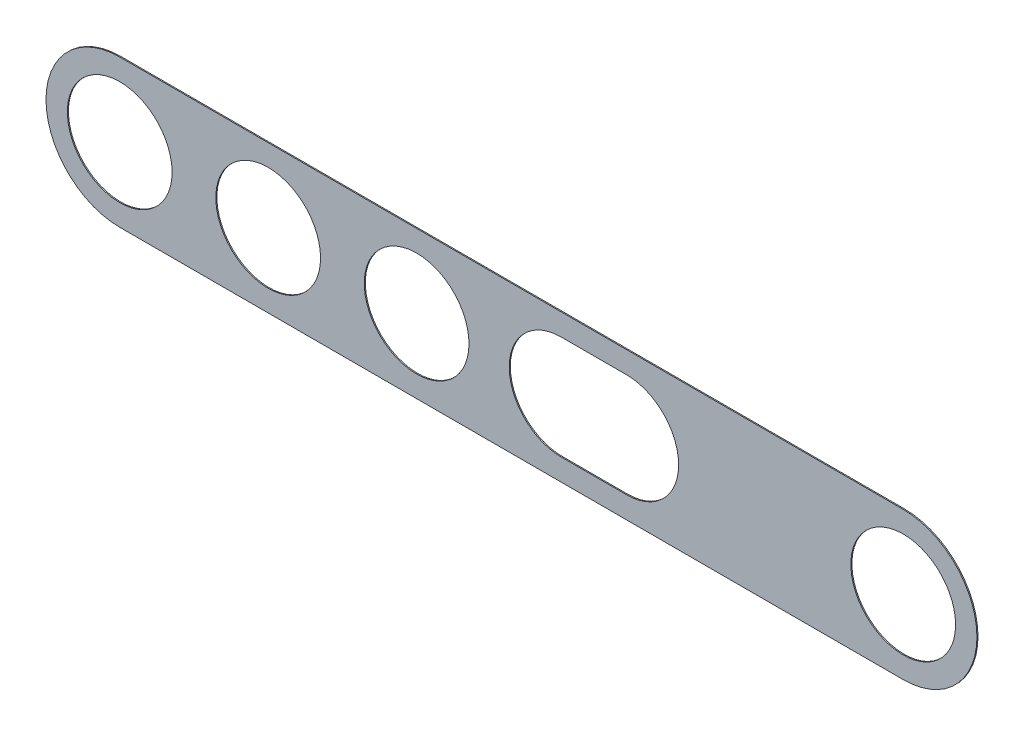
ISO-10303-21;
HEADER;
FILE_DESCRIPTION(('STEP AP214'),'2;1');
FILE_NAME('part.step','',(''),(''),'','','');
FILE_SCHEMA(('AUTOMOTIVE_DESIGN { 1 0 10303 214 1 1 1 1 }'));
ENDSEC;
DATA;
#1=APPLICATION_CONTEXT('core data for automotive mechanical design processes');
#2=APPLICATION_PROTOCOL_DEFINITION('international standard','automotive_design',2000,#1);
#3=PRODUCT_CONTEXT('',#1,'mechanical');
#4=PRODUCT('Part','Part','',(#3));
#5=PRODUCT_RELATED_PRODUCT_CATEGORY('part','',(#4));
#6=PRODUCT_DEFINITION_FORMATION('','',#4);
#7=PRODUCT_DEFINITION_CONTEXT('part definition',#1,'design');
#8=PRODUCT_DEFINITION('design','',#6,#7);
#9=PRODUCT_DEFINITION_SHAPE('','',#8);
#10=(LENGTH_UNIT() NAMED_UNIT(*) SI_UNIT(.MILLI.,.METRE.));
#11=(NAMED_UNIT(*) PLANE_ANGLE_UNIT() SI_UNIT($,.RADIAN.));
#12=(NAMED_UNIT(*) SI_UNIT($,.STERADIAN.) SOLID_ANGLE_UNIT());
#13=UNCERTAINTY_MEASURE_WITH_UNIT(LENGTH_MEASURE(1.E-05),#10,'distance_accuracy_value','');
#14=(GEOMETRIC_REPRESENTATION_CONTEXT(3) GLOBAL_UNCERTAINTY_ASSIGNED_CONTEXT((#13)) GLOBAL_UNIT_ASSIGNED_CONTEXT((#10,
#11,#12)) REPRESENTATION_CONTEXT('',''));
#15=CARTESIAN_POINT('',(0.,0.,0.));
#16=DIRECTION('',(0.,0.,1.));
#17=DIRECTION('',(1.,0.,0.));
#18=AXIS2_PLACEMENT_3D('',#15,#16,#17);
#19=CARTESIAN_POINT('',(0.,0.,-0.805));
#20=DIRECTION('',(0.,0.,1.));
#21=DIRECTION('',(1.,0.,0.));
#22=AXIS2_PLACEMENT_3D('',#19,#20,#21);
#23=PLANE('',#22);
#24=CARTESIAN_POINT('',(13.96785551477,0.,-0.805));
#25=DIRECTION('',(0.,0.,1.));
#26=DIRECTION('',(1.,0.,0.));
#27=AXIS2_PLACEMENT_3D('',#24,#25,#26);
#28=CIRCLE('',#27,6.3);
#29=CARTESIAN_POINT('',(13.96785551477,-6.3,-0.805));
#30=VERTEX_POINT('',#29);
#31=CARTESIAN_POINT('',(13.96785551477,6.3,-0.805));
#32=VERTEX_POINT('',#31);
#33=EDGE_CURVE('E111',#30,#32,#28,.T.);
#34=ORIENTED_EDGE('',*,*,#33,.T.);
#35=DIRECTION('',(1.,0.,0.));
#36=VECTOR('',#35,1.);
#37=CARTESIAN_POINT('',(6.032144485231,6.3,-0.805));
#38=LINE('',#37,#36);
#39=CARTESIAN_POINT('',(6.032144485231,6.3,-0.805));
#40=VERTEX_POINT('',#39);
#41=EDGE_CURVE('E109',#40,#32,#38,.T.);
#42=ORIENTED_EDGE('',*,*,#41,.F.);
#43=CARTESIAN_POINT('',(6.032144485231,0.,-0.805));
#44=DIRECTION('',(0.,0.,1.));
#45=DIRECTION('',(1.,0.,0.));
#46=AXIS2_PLACEMENT_3D('',#43,#44,#45);
#47=CIRCLE('',#46,6.3);
#48=CARTESIAN_POINT('',(6.032144485231,-6.3,-0.805));
#49=VERTEX_POINT('',#48);
#50=EDGE_CURVE('E139',#40,#49,#47,.T.);
#51=ORIENTED_EDGE('',*,*,#50,.T.);
#52=DIRECTION('',(1.,0.,0.));
#53=VECTOR('',#52,1.);
#54=CARTESIAN_POINT('',(13.96785551477,-6.3,-0.805));
#55=LINE('',#54,#53);
#56=EDGE_CURVE('E104',#30,#49,#55,.F.);
#57=ORIENTED_EDGE('',*,*,#56,.F.);
#58=EDGE_LOOP('',(#34,#42,#51,#57));
#59=FACE_BOUND('',#58,.T.);
#60=CARTESIAN_POINT('',(47.5,0.,-0.805));
#61=DIRECTION('',(0.,0.,1.));
#62=DIRECTION('',(1.,0.,0.));
#63=AXIS2_PLACEMENT_3D('',#60,#61,#62);
#64=CIRCLE('',#63,6.35);
#65=CARTESIAN_POINT('',(53.85,0.,-0.805));
#66=VERTEX_POINT('',#65);
#67=EDGE_CURVE('E141',#66,#66,#64,.T.);
#68=ORIENTED_EDGE('',*,*,#67,.T.);
#69=EDGE_LOOP('',(#68));
#70=FACE_BOUND('',#69,.T.);
#71=CARTESIAN_POINT('',(-47.5,0.,-0.805));
#72=DIRECTION('',(0.,0.,1.));
#73=DIRECTION('',(1.,0.,0.));
#74=AXIS2_PLACEMENT_3D('',#71,#72,#73);
#75=CIRCLE('',#74,6.35);
#76=CARTESIAN_POINT('',(-41.15,0.,-0.805));
#77=VERTEX_POINT('',#76);
#78=EDGE_CURVE('E144',#77,#77,#75,.T.);
#79=ORIENTED_EDGE('',*,*,#78,.T.);
#80=EDGE_LOOP('',(#79));
#81=FACE_BOUND('',#80,.T.);
#82=CARTESIAN_POINT('',(-29.5,0.,-0.805));
#83=DIRECTION('',(0.,0.,1.));
#84=DIRECTION('',(1.,0.,0.));
#85=AXIS2_PLACEMENT_3D('',#82,#83,#84);
#86=CIRCLE('',#85,6.35);
#87=CARTESIAN_POINT('',(-23.15,0.,-0.805));
#88=VERTEX_POINT('',#87);
#89=EDGE_CURVE('E147',#88,#88,#86,.T.);
#90=ORIENTED_EDGE('',*,*,#89,.T.);
#91=EDGE_LOOP('',(#90));
#92=FACE_BOUND('',#91,.T.);
#93=CARTESIAN_POINT('',(-11.5,0.,-0.805));
#94=DIRECTION('',(0.,0.,1.));
#95=DIRECTION('',(1.,0.,0.));
#96=AXIS2_PLACEMENT_3D('',#93,#94,#95);
#97=CIRCLE('',#96,6.35);
#98=CARTESIAN_POINT('',(-5.15,0.,-0.805));
#99=VERTEX_POINT('',#98);
#100=EDGE_CURVE('E150',#99,#99,#97,.T.);
#101=ORIENTED_EDGE('',*,*,#100,.T.);
#102=EDGE_LOOP('',(#101));
#103=FACE_BOUND('',#102,.T.);
#104=CARTESIAN_POINT('',(47.5,0.,-0.805));
#105=DIRECTION('',(0.,0.,1.));
#106=DIRECTION('',(1.,0.,0.));
#107=AXIS2_PLACEMENT_3D('',#104,#105,#106);
#108=CIRCLE('',#107,8.94);
#109=CARTESIAN_POINT('',(47.5,-8.94,-0.805));
#110=VERTEX_POINT('',#109);
#111=CARTESIAN_POINT('',(47.5,8.94,-0.805));
#112=VERTEX_POINT('',#111);
#113=EDGE_CURVE('E20',#110,#112,#108,.T.);
#114=ORIENTED_EDGE('',*,*,#113,.F.);
#115=DIRECTION('',(1.,0.,0.));
#116=VECTOR('',#115,1.);
#117=CARTESIAN_POINT('',(-47.5,-8.94,-0.805));
#118=LINE('',#117,#116);
#119=CARTESIAN_POINT('',(-47.5,-8.94,-0.805));
#120=VERTEX_POINT('',#119);
#121=EDGE_CURVE('E82',#120,#110,#118,.T.);
#122=ORIENTED_EDGE('',*,*,#121,.F.);
#123=CARTESIAN_POINT('',(-47.5,0.,-0.805));
#124=DIRECTION('',(0.,0.,1.));
#125=DIRECTION('',(1.,0.,0.));
#126=AXIS2_PLACEMENT_3D('',#123,#124,#125);
#127=CIRCLE('',#126,8.94);
#128=CARTESIAN_POINT('',(-47.5,8.94,-0.805));
#129=VERTEX_POINT('',#128);
#130=EDGE_CURVE('E152',#129,#120,#127,.T.);
#131=ORIENTED_EDGE('',*,*,#130,.F.);
#132=DIRECTION('',(1.,0.,0.));
#133=VECTOR('',#132,1.);
#134=CARTESIAN_POINT('',(47.5,8.94,-0.805));
#135=LINE('',#134,#133);
#136=EDGE_CURVE('E85',#112,#129,#135,.F.);
#137=ORIENTED_EDGE('',*,*,#136,.F.);
#138=EDGE_LOOP('',(#114,#122,#131,#137));
#139=FACE_BOUND('',#138,.T.);
#140=ADVANCED_FACE('F17',(#59,#70,#81,#92,#103,#139),#23,.F.);
#141=CARTESIAN_POINT('',(-47.5,-8.94,-0.675));
#142=DIRECTION('',(0.,-1.,0.));
#143=DIRECTION('',(0.,0.,-1.));
#144=AXIS2_PLACEMENT_3D('',#141,#142,#143);
#145=PLANE('',#144);
#146=DIRECTION('',(0.,0.,1.));
#147=VECTOR('',#146,1.);
#148=CARTESIAN_POINT('',(47.5,-8.94,-0.675));
#149=LINE('',#148,#147);
#150=CARTESIAN_POINT('',(47.5,-8.94,-0.675));
#151=VERTEX_POINT('',#150);
#152=EDGE_CURVE('E88',#151,#110,#149,.F.);
#153=ORIENTED_EDGE('',*,*,#152,.F.);
#154=DIRECTION('',(1.,0.,0.));
#155=VECTOR('',#154,1.);
#156=CARTESIAN_POINT('',(0.,-8.94,-0.675));
#157=LINE('',#156,#155);
#158=CARTESIAN_POINT('',(-47.5,-8.94,-0.675));
#159=VERTEX_POINT('',#158);
#160=EDGE_CURVE('E136',#159,#151,#157,.T.);
#161=ORIENTED_EDGE('',*,*,#160,.F.);
#162=DIRECTION('',(0.,0.,1.));
#163=VECTOR('',#162,1.);
#164=CARTESIAN_POINT('',(-47.5,-8.94,-0.675));
#165=LINE('',#164,#163);
#166=EDGE_CURVE('E94',#120,#159,#165,.T.);
#167=ORIENTED_EDGE('',*,*,#166,.F.);
#168=ORIENTED_EDGE('',*,*,#121,.T.);
#169=EDGE_LOOP('',(#153,#161,#167,#168));
#170=FACE_BOUND('',#169,.T.);
#171=ADVANCED_FACE('F90',(#170),#145,.T.);
#172=CARTESIAN_POINT('',(47.5,0.,-0.675));
#173=DIRECTION('',(0.,0.,1.));
#174=DIRECTION('',(1.,0.,0.));
#175=AXIS2_PLACEMENT_3D('',#172,#173,#174);
#176=CYLINDRICAL_SURFACE('',#175,8.94);
#177=DIRECTION('',(0.,0.,1.));
#178=VECTOR('',#177,1.);
#179=CARTESIAN_POINT('',(47.5,8.94,-0.675));
#180=LINE('',#179,#178);
#181=CARTESIAN_POINT('',(47.5,8.94,-0.675));
#182=VERTEX_POINT('',#181);
#183=EDGE_CURVE('E87',#182,#112,#180,.F.);
#184=ORIENTED_EDGE('',*,*,#183,.F.);
#185=CARTESIAN_POINT('',(47.5,0.,-0.675));
#186=DIRECTION('',(0.,0.,1.));
#187=DIRECTION('',(1.,0.,0.));
#188=AXIS2_PLACEMENT_3D('',#185,#186,#187);
#189=CIRCLE('',#188,8.94);
#190=EDGE_CURVE('E98',#151,#182,#189,.T.);
#191=ORIENTED_EDGE('',*,*,#190,.F.);
#192=ORIENTED_EDGE('',*,*,#152,.T.);
#193=ORIENTED_EDGE('',*,*,#113,.T.);
#194=EDGE_LOOP('',(#184,#191,#192,#193));
#195=FACE_BOUND('',#194,.T.);
#196=ADVANCED_FACE('F97',(#195),#176,.T.);
#197=CARTESIAN_POINT('',(47.5,8.94,-0.675));
#198=DIRECTION('',(0.,1.,0.));
#199=DIRECTION('',(0.,0.,1.));
#200=AXIS2_PLACEMENT_3D('',#197,#198,#199);
#201=PLANE('',#200);
#202=DIRECTION('',(0.,0.,1.));
#203=VECTOR('',#202,1.);
#204=CARTESIAN_POINT('',(-47.5,8.94,-0.675));
#205=LINE('',#204,#203);
#206=CARTESIAN_POINT('',(-47.5,8.94,-0.675));
#207=VERTEX_POINT('',#206);
#208=EDGE_CURVE('E115',#207,#129,#205,.F.);
#209=ORIENTED_EDGE('',*,*,#208,.F.);
#210=DIRECTION('',(1.,0.,0.));
#211=VECTOR('',#210,1.);
#212=CARTESIAN_POINT('',(0.,8.94,-0.675));
#213=LINE('',#212,#211);
#214=EDGE_CURVE('E134',#182,#207,#213,.F.);
#215=ORIENTED_EDGE('',*,*,#214,.F.);
#216=ORIENTED_EDGE('',*,*,#183,.T.);
#217=ORIENTED_EDGE('',*,*,#136,.T.);
#218=EDGE_LOOP('',(#209,#215,#216,#217));
#219=FACE_BOUND('',#218,.T.);
#220=ADVANCED_FACE('F209',(#219),#201,.T.);
#221=CARTESIAN_POINT('',(-47.5,0.,-0.675));
#222=DIRECTION('',(0.,0.,1.));
#223=DIRECTION('',(1.,0.,0.));
#224=AXIS2_PLACEMENT_3D('',#221,#222,#223);
#225=CYLINDRICAL_SURFACE('',#224,8.94);
#226=ORIENTED_EDGE('',*,*,#166,.T.);
#227=CARTESIAN_POINT('',(-47.5,0.,-0.675));
#228=DIRECTION('',(0.,0.,1.));
#229=DIRECTION('',(1.,0.,0.));
#230=AXIS2_PLACEMENT_3D('',#227,#228,#229);
#231=CIRCLE('',#230,8.94);
#232=EDGE_CURVE('E132',#207,#159,#231,.T.);
#233=ORIENTED_EDGE('',*,*,#232,.F.);
#234=ORIENTED_EDGE('',*,*,#208,.T.);
#235=ORIENTED_EDGE('',*,*,#130,.T.);
#236=EDGE_LOOP('',(#226,#233,#234,#235));
#237=FACE_BOUND('',#236,.T.);
#238=ADVANCED_FACE('F200',(#237),#225,.T.);
#239=CARTESIAN_POINT('',(-11.5,0.,-0.675));
#240=DIRECTION('',(0.,0.,1.));
#241=DIRECTION('',(1.,0.,0.));
#242=AXIS2_PLACEMENT_3D('',#239,#240,#241);
#243=CYLINDRICAL_SURFACE('',#242,6.35);
#244=ORIENTED_EDGE('',*,*,#100,.F.);
#245=EDGE_LOOP('',(#244));
#246=FACE_BOUND('',#245,.T.);
#247=CARTESIAN_POINT('',(-11.5,0.,-0.675));
#248=DIRECTION('',(0.,0.,1.));
#249=DIRECTION('',(1.,0.,0.));
#250=AXIS2_PLACEMENT_3D('',#247,#248,#249);
#251=CIRCLE('',#250,6.35);
#252=CARTESIAN_POINT('',(-5.15,0.,-0.675));
#253=VERTEX_POINT('',#252);
#254=EDGE_CURVE('E129',#253,#253,#251,.F.);
#255=ORIENTED_EDGE('',*,*,#254,.F.);
#256=EDGE_LOOP('',(#255));
#257=FACE_BOUND('',#256,.T.);
#258=ADVANCED_FACE('F196',(#246,#257),#243,.F.);
#259=CARTESIAN_POINT('',(-29.5,0.,-0.675));
#260=DIRECTION('',(0.,0.,1.));
#261=DIRECTION('',(1.,0.,0.));
#262=AXIS2_PLACEMENT_3D('',#259,#260,#261);
#263=CYLINDRICAL_SURFACE('',#262,6.35);
#264=ORIENTED_EDGE('',*,*,#89,.F.);
#265=EDGE_LOOP('',(#264));
#266=FACE_BOUND('',#265,.T.);
#267=CARTESIAN_POINT('',(-29.5,0.,-0.675));
#268=DIRECTION('',(0.,0.,1.));
#269=DIRECTION('',(1.,0.,0.));
#270=AXIS2_PLACEMENT_3D('',#267,#268,#269);
#271=CIRCLE('',#270,6.35);
#272=CARTESIAN_POINT('',(-23.15,0.,-0.675));
#273=VERTEX_POINT('',#272);
#274=EDGE_CURVE('E126',#273,#273,#271,.F.);
#275=ORIENTED_EDGE('',*,*,#274,.F.);
#276=EDGE_LOOP('',(#275));
#277=FACE_BOUND('',#276,.T.);
#278=ADVANCED_FACE('F199',(#266,#277),#263,.F.);
#279=CARTESIAN_POINT('',(-47.5,0.,-0.675));
#280=DIRECTION('',(0.,0.,1.));
#281=DIRECTION('',(1.,0.,0.));
#282=AXIS2_PLACEMENT_3D('',#279,#280,#281);
#283=CYLINDRICAL_SURFACE('',#282,6.35);
#284=ORIENTED_EDGE('',*,*,#78,.F.);
#285=EDGE_LOOP('',(#284));
#286=FACE_BOUND('',#285,.T.);
#287=CARTESIAN_POINT('',(-47.5,0.,-0.675));
#288=DIRECTION('',(0.,0.,1.));
#289=DIRECTION('',(1.,0.,0.));
#290=AXIS2_PLACEMENT_3D('',#287,#288,#289);
#291=CIRCLE('',#290,6.35);
#292=CARTESIAN_POINT('',(-41.15,0.,-0.675));
#293=VERTEX_POINT('',#292);
#294=EDGE_CURVE('E123',#293,#293,#291,.F.);
#295=ORIENTED_EDGE('',*,*,#294,.F.);
#296=EDGE_LOOP('',(#295));
#297=FACE_BOUND('',#296,.T.);
#298=ADVANCED_FACE('F257',(#286,#297),#283,.F.);
#299=CARTESIAN_POINT('',(47.5,0.,-0.675));
#300=DIRECTION('',(0.,0.,1.));
#301=DIRECTION('',(1.,0.,0.));
#302=AXIS2_PLACEMENT_3D('',#299,#300,#301);
#303=CYLINDRICAL_SURFACE('',#302,6.35);
#304=ORIENTED_EDGE('',*,*,#67,.F.);
#305=EDGE_LOOP('',(#304));
#306=FACE_BOUND('',#305,.T.);
#307=CARTESIAN_POINT('',(47.5,0.,-0.675));
#308=DIRECTION('',(0.,0.,1.));
#309=DIRECTION('',(1.,0.,0.));
#310=AXIS2_PLACEMENT_3D('',#307,#308,#309);
#311=CIRCLE('',#310,6.35);
#312=CARTESIAN_POINT('',(53.85,0.,-0.675));
#313=VERTEX_POINT('',#312);
#314=EDGE_CURVE('E120',#313,#313,#311,.F.);
#315=ORIENTED_EDGE('',*,*,#314,.F.);
#316=EDGE_LOOP('',(#315));
#317=FACE_BOUND('',#316,.T.);
#318=ADVANCED_FACE('F266',(#306,#317),#303,.F.);
#319=CARTESIAN_POINT('',(6.032144485231,0.,-0.675));
#320=DIRECTION('',(0.,0.,1.));
#321=DIRECTION('',(1.,0.,0.));
#322=AXIS2_PLACEMENT_3D('',#319,#320,#321);
#323=CYLINDRICAL_SURFACE('',#322,6.3);
#324=ORIENTED_EDGE('',*,*,#50,.F.);
#325=DIRECTION('',(0.,0.,-1.));
#326=VECTOR('',#325,1.);
#327=CARTESIAN_POINT('',(6.032144485231,6.3,-0.675));
#328=LINE('',#327,#326);
#329=CARTESIAN_POINT('',(6.032144485231,6.3,-0.675));
#330=VERTEX_POINT('',#329);
#331=EDGE_CURVE('E112',#330,#40,#328,.T.);
#332=ORIENTED_EDGE('',*,*,#331,.F.);
#333=CARTESIAN_POINT('',(6.032144485231,0.,-0.675));
#334=DIRECTION('',(0.,0.,1.));
#335=DIRECTION('',(1.,0.,0.));
#336=AXIS2_PLACEMENT_3D('',#333,#334,#335);
#337=CIRCLE('',#336,6.3);
#338=CARTESIAN_POINT('',(6.032144485231,-6.3,-0.675));
#339=VERTEX_POINT('',#338);
#340=EDGE_CURVE('E118',#339,#330,#337,.F.);
#341=ORIENTED_EDGE('',*,*,#340,.F.);
#342=DIRECTION('',(0.,0.,1.));
#343=VECTOR('',#342,1.);
#344=CARTESIAN_POINT('',(6.032144485231,-6.3,-0.675));
#345=LINE('',#344,#343);
#346=EDGE_CURVE('E107',#49,#339,#345,.T.);
#347=ORIENTED_EDGE('',*,*,#346,.F.);
#348=EDGE_LOOP('',(#324,#332,#341,#347));
#349=FACE_BOUND('',#348,.T.);
#350=ADVANCED_FACE('F184',(#349),#323,.F.);
#351=CARTESIAN_POINT('',(6.032144485231,6.3,-0.675));
#352=DIRECTION('',(0.,-1.,0.));
#353=DIRECTION('',(0.,0.,-1.));
#354=AXIS2_PLACEMENT_3D('',#351,#352,#353);
#355=PLANE('',#354);
#356=DIRECTION('',(0.,0.,1.));
#357=VECTOR('',#356,1.);
#358=CARTESIAN_POINT('',(13.96785551477,6.3,-0.675));
#359=LINE('',#358,#357);
#360=CARTESIAN_POINT('',(13.96785551477,6.3,-0.675));
#361=VERTEX_POINT('',#360);
#362=EDGE_CURVE('E138',#32,#361,#359,.T.);
#363=ORIENTED_EDGE('',*,*,#362,.T.);
#364=DIRECTION('',(1.,0.,0.));
#365=VECTOR('',#364,1.);
#366=CARTESIAN_POINT('',(0.,6.3,-0.675));
#367=LINE('',#366,#365);
#368=EDGE_CURVE('E117',#330,#361,#367,.T.);
#369=ORIENTED_EDGE('',*,*,#368,.F.);
#370=ORIENTED_EDGE('',*,*,#331,.T.);
#371=ORIENTED_EDGE('',*,*,#41,.T.);
#372=EDGE_LOOP('',(#363,#369,#370,#371));
#373=FACE_BOUND('',#372,.T.);
#374=ADVANCED_FACE('F173',(#373),#355,.T.);
#375=CARTESIAN_POINT('',(13.96785551477,0.,-0.675));
#376=DIRECTION('',(0.,0.,1.));
#377=DIRECTION('',(1.,0.,0.));
#378=AXIS2_PLACEMENT_3D('',#375,#376,#377);
#379=CYLINDRICAL_SURFACE('',#378,6.3);
#380=ORIENTED_EDGE('',*,*,#33,.F.);
#381=DIRECTION('',(0.,0.,1.));
#382=VECTOR('',#381,1.);
#383=CARTESIAN_POINT('',(13.96785551477,-6.3,-0.675));
#384=LINE('',#383,#382);
#385=CARTESIAN_POINT('',(13.96785551477,-6.3,-0.675));
#386=VERTEX_POINT('',#385);
#387=EDGE_CURVE('E108',#386,#30,#384,.F.);
#388=ORIENTED_EDGE('',*,*,#387,.F.);
#389=CARTESIAN_POINT('',(13.96785551477,0.,-0.675));
#390=DIRECTION('',(0.,0.,1.));
#391=DIRECTION('',(1.,0.,0.));
#392=AXIS2_PLACEMENT_3D('',#389,#390,#391);
#393=CIRCLE('',#392,6.3);
#394=EDGE_CURVE('E26',#361,#386,#393,.F.);
#395=ORIENTED_EDGE('',*,*,#394,.F.);
#396=ORIENTED_EDGE('',*,*,#362,.F.);
#397=EDGE_LOOP('',(#380,#388,#395,#396));
#398=FACE_BOUND('',#397,.T.);
#399=ADVANCED_FACE('F177',(#398),#379,.F.);
#400=CARTESIAN_POINT('',(13.96785551477,-6.3,-0.675));
#401=DIRECTION('',(0.,1.,0.));
#402=DIRECTION('',(0.,0.,1.));
#403=AXIS2_PLACEMENT_3D('',#400,#401,#402);
#404=PLANE('',#403);
#405=ORIENTED_EDGE('',*,*,#346,.T.);
#406=DIRECTION('',(1.,0.,0.));
#407=VECTOR('',#406,1.);
#408=CARTESIAN_POINT('',(0.,-6.3,-0.675));
#409=LINE('',#408,#407);
#410=EDGE_CURVE('E11',#386,#339,#409,.F.);
#411=ORIENTED_EDGE('',*,*,#410,.F.);
#412=ORIENTED_EDGE('',*,*,#387,.T.);
#413=ORIENTED_EDGE('',*,*,#56,.T.);
#414=EDGE_LOOP('',(#405,#411,#412,#413));
#415=FACE_BOUND('',#414,.T.);
#416=ADVANCED_FACE('F181',(#415),#404,.T.);
#417=CARTESIAN_POINT('',(0.,0.,-0.675));
#418=DIRECTION('',(0.,0.,1.));
#419=DIRECTION('',(1.,0.,0.));
#420=AXIS2_PLACEMENT_3D('',#417,#418,#419);
#421=PLANE('',#420);
#422=ORIENTED_EDGE('',*,*,#394,.T.);
#423=ORIENTED_EDGE('',*,*,#410,.T.);
#424=ORIENTED_EDGE('',*,*,#340,.T.);
#425=ORIENTED_EDGE('',*,*,#368,.T.);
#426=EDGE_LOOP('',(#422,#423,#424,#425));
#427=FACE_BOUND('',#426,.T.);
#428=ORIENTED_EDGE('',*,*,#314,.T.);
#429=EDGE_LOOP('',(#428));
#430=FACE_BOUND('',#429,.T.);
#431=ORIENTED_EDGE('',*,*,#294,.T.);
#432=EDGE_LOOP('',(#431));
#433=FACE_BOUND('',#432,.T.);
#434=ORIENTED_EDGE('',*,*,#274,.T.);
#435=EDGE_LOOP('',(#434));
#436=FACE_BOUND('',#435,.T.);
#437=ORIENTED_EDGE('',*,*,#254,.T.);
#438=EDGE_LOOP('',(#437));
#439=FACE_BOUND('',#438,.T.);
#440=ORIENTED_EDGE('',*,*,#232,.T.);
#441=ORIENTED_EDGE('',*,*,#160,.T.);
#442=ORIENTED_EDGE('',*,*,#190,.T.);
#443=ORIENTED_EDGE('',*,*,#214,.T.);
#444=EDGE_LOOP('',(#440,#441,#442,#443));
#445=FACE_BOUND('',#444,.T.);
#446=ADVANCED_FACE('F169',(#427,#430,#433,#436,#439,#445),#421,.T.);
#447=CLOSED_SHELL('',(#140,#171,#196,#220,#238,#258,#278,#298,#318,#350,#374,#399,#416,#446));
#448=MANIFOLD_SOLID_BREP('B1',#447);
#449=ADVANCED_BREP_SHAPE_REPRESENTATION('',(#18,#448),#14);
#450=SHAPE_DEFINITION_REPRESENTATION(#9,#449);
ENDSEC;
END-ISO-10303-21;
